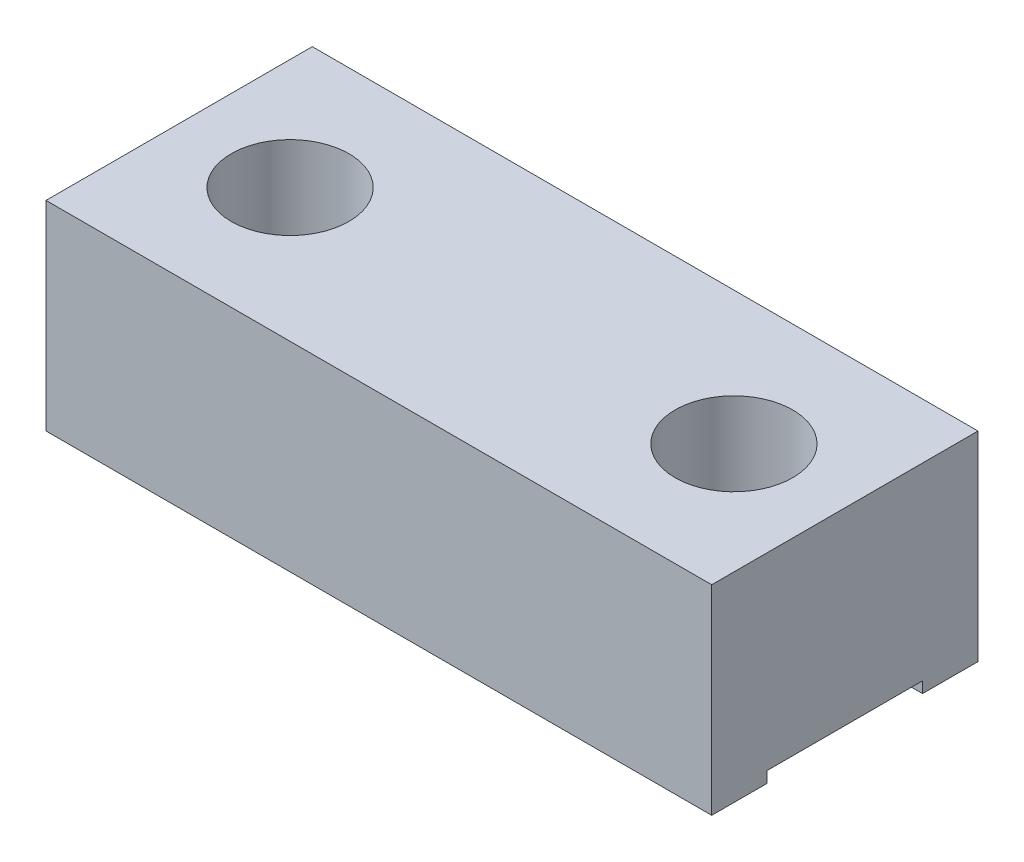
ISO-10303-21;
HEADER;
FILE_DESCRIPTION(('STEP AP214'),'2;1');
FILE_NAME('part.step','',(''),(''),'','','');
FILE_SCHEMA(('AUTOMOTIVE_DESIGN { 1 0 10303 214 1 1 1 1 }'));
ENDSEC;
DATA;
#1=APPLICATION_CONTEXT('core data for automotive mechanical design processes');
#2=APPLICATION_PROTOCOL_DEFINITION('international standard','automotive_design',2000,#1);
#3=PRODUCT_CONTEXT('',#1,'mechanical');
#4=PRODUCT('Part','Part','',(#3));
#5=PRODUCT_RELATED_PRODUCT_CATEGORY('part','',(#4));
#6=PRODUCT_DEFINITION_FORMATION('','',#4);
#7=PRODUCT_DEFINITION_CONTEXT('part definition',#1,'design');
#8=PRODUCT_DEFINITION('design','',#6,#7);
#9=PRODUCT_DEFINITION_SHAPE('','',#8);
#10=(LENGTH_UNIT() NAMED_UNIT(*) SI_UNIT(.MILLI.,.METRE.));
#11=(NAMED_UNIT(*) PLANE_ANGLE_UNIT() SI_UNIT($,.RADIAN.));
#12=(NAMED_UNIT(*) SI_UNIT($,.STERADIAN.) SOLID_ANGLE_UNIT());
#13=UNCERTAINTY_MEASURE_WITH_UNIT(LENGTH_MEASURE(1.E-05),#10,'distance_accuracy_value','');
#14=(GEOMETRIC_REPRESENTATION_CONTEXT(3) GLOBAL_UNCERTAINTY_ASSIGNED_CONTEXT((#13)) GLOBAL_UNIT_ASSIGNED_CONTEXT((#10,
#11,#12)) REPRESENTATION_CONTEXT('',''));
#15=CARTESIAN_POINT('',(0.,0.,0.));
#16=DIRECTION('',(0.,0.,1.));
#17=DIRECTION('',(1.,0.,0.));
#18=AXIS2_PLACEMENT_3D('',#15,#16,#17);
#19=CARTESIAN_POINT('',(-15.,9.5,-2.));
#20=DIRECTION('',(0.,-1.,0.));
#21=DIRECTION('',(0.,0.,-1.));
#22=AXIS2_PLACEMENT_3D('',#19,#20,#21);
#23=PLANE('',#22);
#24=DIRECTION('',(1.,0.,0.));
#25=VECTOR('',#24,1.);
#26=CARTESIAN_POINT('',(-15.,9.5,-14.));
#27=LINE('',#26,#25);
#28=CARTESIAN_POINT('',(-15.,9.5,-14.));
#29=VERTEX_POINT('',#28);
#30=CARTESIAN_POINT('',(15.,9.5,-14.));
#31=VERTEX_POINT('',#30);
#32=EDGE_CURVE('E158',#29,#31,#27,.T.);
#33=ORIENTED_EDGE('',*,*,#32,.F.);
#34=DIRECTION('',(0.,0.,-1.));
#35=VECTOR('',#34,1.);
#36=CARTESIAN_POINT('',(-15.,9.5,-2.));
#37=LINE('',#36,#35);
#38=CARTESIAN_POINT('',(-15.,9.5,-2.));
#39=VERTEX_POINT('',#38);
#40=EDGE_CURVE('E157',#39,#29,#37,.T.);
#41=ORIENTED_EDGE('',*,*,#40,.F.);
#42=DIRECTION('',(1.,0.,0.));
#43=VECTOR('',#42,1.);
#44=CARTESIAN_POINT('',(-15.,9.5,-2.));
#45=LINE('',#44,#43);
#46=CARTESIAN_POINT('',(15.,9.5,-2.));
#47=VERTEX_POINT('',#46);
#48=EDGE_CURVE('E85',#39,#47,#45,.T.);
#49=ORIENTED_EDGE('',*,*,#48,.T.);
#50=DIRECTION('',(0.,0.,-1.));
#51=VECTOR('',#50,1.);
#52=CARTESIAN_POINT('',(15.,9.5,-2.));
#53=LINE('',#52,#51);
#54=EDGE_CURVE('E81',#47,#31,#53,.T.);
#55=ORIENTED_EDGE('',*,*,#54,.T.);
#56=EDGE_LOOP('',(#33,#41,#49,#55));
#57=FACE_BOUND('',#56,.T.);
#58=CARTESIAN_POINT('',(9.99999999999999,9.5,-8.));
#59=DIRECTION('',(0.,1.,0.));
#60=DIRECTION('',(0.,0.,1.));
#61=AXIS2_PLACEMENT_3D('',#58,#59,#60);
#62=CIRCLE('',#61,2.64999999999999);
#63=CARTESIAN_POINT('',(9.99999999999999,9.5,-5.35000000000001));
#64=VERTEX_POINT('',#63);
#65=EDGE_CURVE('E198',#64,#64,#62,.T.);
#66=ORIENTED_EDGE('',*,*,#65,.F.);
#67=EDGE_LOOP('',(#66));
#68=FACE_BOUND('',#67,.T.);
#69=CARTESIAN_POINT('',(-9.99999999999999,9.5,-8.));
#70=DIRECTION('',(0.,1.,0.));
#71=DIRECTION('',(0.,0.,1.));
#72=AXIS2_PLACEMENT_3D('',#69,#70,#71);
#73=CIRCLE('',#72,2.64999999999999);
#74=CARTESIAN_POINT('',(-9.99999999999999,9.5,-5.35000000000001));
#75=VERTEX_POINT('',#74);
#76=EDGE_CURVE('E204',#75,#75,#73,.T.);
#77=ORIENTED_EDGE('',*,*,#76,.F.);
#78=EDGE_LOOP('',(#77));
#79=FACE_BOUND('',#78,.T.);
#80=ADVANCED_FACE('F49',(#57,#68,#79),#23,.F.);
#81=CARTESIAN_POINT('',(-15.,0.5,-11.5));
#82=DIRECTION('',(0.,1.,0.));
#83=DIRECTION('',(0.,0.,1.));
#84=AXIS2_PLACEMENT_3D('',#81,#82,#83);
#85=PLANE('',#84);
#86=DIRECTION('',(1.,0.,0.));
#87=VECTOR('',#86,1.);
#88=CARTESIAN_POINT('',(-15.,0.5,-11.5));
#89=LINE('',#88,#87);
#90=CARTESIAN_POINT('',(-15.,0.5,-11.5));
#91=VERTEX_POINT('',#90);
#92=CARTESIAN_POINT('',(15.,0.5,-11.5));
#93=VERTEX_POINT('',#92);
#94=EDGE_CURVE('E153',#91,#93,#89,.T.);
#95=ORIENTED_EDGE('',*,*,#94,.F.);
#96=DIRECTION('',(0.,0.,1.));
#97=VECTOR('',#96,1.);
#98=CARTESIAN_POINT('',(-15.,0.5,-11.5));
#99=LINE('',#98,#97);
#100=CARTESIAN_POINT('',(-15.,0.5,-14.));
#101=VERTEX_POINT('',#100);
#102=EDGE_CURVE('E145',#101,#91,#99,.T.);
#103=ORIENTED_EDGE('',*,*,#102,.F.);
#104=DIRECTION('',(1.,0.,0.));
#105=VECTOR('',#104,1.);
#106=CARTESIAN_POINT('',(-15.,0.5,-14.));
#107=LINE('',#106,#105);
#108=CARTESIAN_POINT('',(15.,0.5,-14.));
#109=VERTEX_POINT('',#108);
#110=EDGE_CURVE('E93',#101,#109,#107,.T.);
#111=ORIENTED_EDGE('',*,*,#110,.T.);
#112=DIRECTION('',(0.,0.,1.));
#113=VECTOR('',#112,1.);
#114=CARTESIAN_POINT('',(15.,0.5,-11.5));
#115=LINE('',#114,#113);
#116=EDGE_CURVE('E164',#109,#93,#115,.T.);
#117=ORIENTED_EDGE('',*,*,#116,.T.);
#118=EDGE_LOOP('',(#95,#103,#111,#117));
#119=FACE_BOUND('',#118,.T.);
#120=ADVANCED_FACE('F189',(#119),#85,.F.);
#121=CARTESIAN_POINT('',(-15.,0.5,-11.5));
#122=DIRECTION('',(0.,0.,-1.));
#123=DIRECTION('',(-1.,0.,0.));
#124=AXIS2_PLACEMENT_3D('',#121,#122,#123);
#125=PLANE('',#124);
#126=DIRECTION('',(1.,0.,0.));
#127=VECTOR('',#126,1.);
#128=CARTESIAN_POINT('',(-15.,1.,-11.5));
#129=LINE('',#128,#127);
#130=CARTESIAN_POINT('',(-15.,1.,-11.5));
#131=VERTEX_POINT('',#130);
#132=CARTESIAN_POINT('',(15.,1.,-11.5));
#133=VERTEX_POINT('',#132);
#134=EDGE_CURVE('E132',#131,#133,#129,.T.);
#135=ORIENTED_EDGE('',*,*,#134,.F.);
#136=DIRECTION('',(0.,1.,0.));
#137=VECTOR('',#136,1.);
#138=CARTESIAN_POINT('',(-15.,0.5,-11.5));
#139=LINE('',#138,#137);
#140=EDGE_CURVE('E143',#91,#131,#139,.T.);
#141=ORIENTED_EDGE('',*,*,#140,.F.);
#142=ORIENTED_EDGE('',*,*,#94,.T.);
#143=DIRECTION('',(0.,1.,0.));
#144=VECTOR('',#143,1.);
#145=CARTESIAN_POINT('',(15.,0.5,-11.5));
#146=LINE('',#145,#144);
#147=EDGE_CURVE('E186',#93,#133,#146,.T.);
#148=ORIENTED_EDGE('',*,*,#147,.T.);
#149=EDGE_LOOP('',(#135,#141,#142,#148));
#150=FACE_BOUND('',#149,.T.);
#151=ADVANCED_FACE('F217',(#150),#125,.F.);
#152=CARTESIAN_POINT('',(-15.,1.,-4.5));
#153=DIRECTION('',(0.,1.,0.));
#154=DIRECTION('',(0.,0.,1.));
#155=AXIS2_PLACEMENT_3D('',#152,#153,#154);
#156=PLANE('',#155);
#157=CARTESIAN_POINT('',(-9.99999999999999,0.999999999999999,-8.));
#158=DIRECTION('',(0.,1.,0.));
#159=DIRECTION('',(0.,0.,1.));
#160=AXIS2_PLACEMENT_3D('',#157,#158,#159);
#161=CIRCLE('',#160,2.64999999999999);
#162=CARTESIAN_POINT('',(-9.99999999999999,0.999999999999999,-5.35000000000001));
#163=VERTEX_POINT('',#162);
#164=EDGE_CURVE('E201',#163,#163,#161,.T.);
#165=ORIENTED_EDGE('',*,*,#164,.T.);
#166=EDGE_LOOP('',(#165));
#167=FACE_BOUND('',#166,.T.);
#168=CARTESIAN_POINT('',(9.99999999999999,0.999999999999999,-8.));
#169=DIRECTION('',(0.,1.,0.));
#170=DIRECTION('',(0.,0.,1.));
#171=AXIS2_PLACEMENT_3D('',#168,#169,#170);
#172=CIRCLE('',#171,2.64999999999999);
#173=CARTESIAN_POINT('',(9.99999999999999,0.999999999999999,-5.35000000000001));
#174=VERTEX_POINT('',#173);
#175=EDGE_CURVE('E160',#174,#174,#172,.T.);
#176=ORIENTED_EDGE('',*,*,#175,.T.);
#177=EDGE_LOOP('',(#176));
#178=FACE_BOUND('',#177,.T.);
#179=DIRECTION('',(1.,0.,0.));
#180=VECTOR('',#179,1.);
#181=CARTESIAN_POINT('',(-15.,1.,-4.5));
#182=LINE('',#181,#180);
#183=CARTESIAN_POINT('',(-15.,1.,-4.5));
#184=VERTEX_POINT('',#183);
#185=CARTESIAN_POINT('',(15.,1.,-4.5));
#186=VERTEX_POINT('',#185);
#187=EDGE_CURVE('E120',#184,#186,#182,.T.);
#188=ORIENTED_EDGE('',*,*,#187,.F.);
#189=DIRECTION('',(0.,0.,1.));
#190=VECTOR('',#189,1.);
#191=CARTESIAN_POINT('',(-15.,1.,-4.5));
#192=LINE('',#191,#190);
#193=EDGE_CURVE('E124',#131,#184,#192,.T.);
#194=ORIENTED_EDGE('',*,*,#193,.F.);
#195=ORIENTED_EDGE('',*,*,#134,.T.);
#196=DIRECTION('',(0.,0.,1.));
#197=VECTOR('',#196,1.);
#198=CARTESIAN_POINT('',(15.,1.,-4.5));
#199=LINE('',#198,#197);
#200=EDGE_CURVE('E127',#133,#186,#199,.T.);
#201=ORIENTED_EDGE('',*,*,#200,.T.);
#202=EDGE_LOOP('',(#188,#194,#195,#201));
#203=FACE_BOUND('',#202,.T.);
#204=ADVANCED_FACE('F122',(#167,#178,#203),#156,.F.);
#205=CARTESIAN_POINT('',(15.,58.9187454245971,-2.));
#206=DIRECTION('',(-1.,0.,0.));
#207=DIRECTION('',(0.,0.,1.));
#208=AXIS2_PLACEMENT_3D('',#205,#206,#207);
#209=PLANE('',#208);
#210=DIRECTION('',(0.,-1.,0.));
#211=VECTOR('',#210,1.);
#212=CARTESIAN_POINT('',(15.,58.9187454245971,-2.));
#213=LINE('',#212,#211);
#214=CARTESIAN_POINT('',(15.,0.5,-2.));
#215=VERTEX_POINT('',#214);
#216=EDGE_CURVE('E58',#47,#215,#213,.T.);
#217=ORIENTED_EDGE('',*,*,#216,.T.);
#218=DIRECTION('',(0.,0.,1.));
#219=VECTOR('',#218,1.);
#220=CARTESIAN_POINT('',(15.,0.5,-2.));
#221=LINE('',#220,#219);
#222=CARTESIAN_POINT('',(15.,0.5,-4.5));
#223=VERTEX_POINT('',#222);
#224=EDGE_CURVE('E177',#223,#215,#221,.T.);
#225=ORIENTED_EDGE('',*,*,#224,.F.);
#226=DIRECTION('',(0.,-1.,0.));
#227=VECTOR('',#226,1.);
#228=CARTESIAN_POINT('',(15.,0.5,-4.5));
#229=LINE('',#228,#227);
#230=EDGE_CURVE('E183',#186,#223,#229,.T.);
#231=ORIENTED_EDGE('',*,*,#230,.F.);
#232=ORIENTED_EDGE('',*,*,#200,.F.);
#233=ORIENTED_EDGE('',*,*,#147,.F.);
#234=ORIENTED_EDGE('',*,*,#116,.F.);
#235=DIRECTION('',(0.,-1.,0.));
#236=VECTOR('',#235,1.);
#237=CARTESIAN_POINT('',(15.,58.9187454245971,-14.));
#238=LINE('',#237,#236);
#239=EDGE_CURVE('E170',#31,#109,#238,.T.);
#240=ORIENTED_EDGE('',*,*,#239,.F.);
#241=ORIENTED_EDGE('',*,*,#54,.F.);
#242=EDGE_LOOP('',(#217,#225,#231,#232,#233,#234,#240,#241));
#243=FACE_BOUND('',#242,.T.);
#244=ADVANCED_FACE('F176',(#243),#209,.F.);
#245=CARTESIAN_POINT('',(-15.,0.5,-4.5));
#246=DIRECTION('',(0.,0.,1.));
#247=DIRECTION('',(1.,0.,0.));
#248=AXIS2_PLACEMENT_3D('',#245,#246,#247);
#249=PLANE('',#248);
#250=DIRECTION('',(1.,0.,0.));
#251=VECTOR('',#250,1.);
#252=CARTESIAN_POINT('',(-15.,0.5,-4.5));
#253=LINE('',#252,#251);
#254=CARTESIAN_POINT('',(-15.,0.5,-4.5));
#255=VERTEX_POINT('',#254);
#256=EDGE_CURVE('E131',#255,#223,#253,.T.);
#257=ORIENTED_EDGE('',*,*,#256,.F.);
#258=DIRECTION('',(0.,-1.,0.));
#259=VECTOR('',#258,1.);
#260=CARTESIAN_POINT('',(-15.,0.5,-4.5));
#261=LINE('',#260,#259);
#262=EDGE_CURVE('E135',#184,#255,#261,.T.);
#263=ORIENTED_EDGE('',*,*,#262,.F.);
#264=ORIENTED_EDGE('',*,*,#187,.T.);
#265=ORIENTED_EDGE('',*,*,#230,.T.);
#266=EDGE_LOOP('',(#257,#263,#264,#265));
#267=FACE_BOUND('',#266,.T.);
#268=ADVANCED_FACE('F136',(#267),#249,.F.);
#269=CARTESIAN_POINT('',(-15.,58.9187454245971,-14.));
#270=DIRECTION('',(1.,0.,0.));
#271=DIRECTION('',(0.,0.,-1.));
#272=AXIS2_PLACEMENT_3D('',#269,#270,#271);
#273=PLANE('',#272);
#274=ORIENTED_EDGE('',*,*,#262,.T.);
#275=DIRECTION('',(0.,0.,1.));
#276=VECTOR('',#275,1.);
#277=CARTESIAN_POINT('',(-15.,0.5,-2.));
#278=LINE('',#277,#276);
#279=CARTESIAN_POINT('',(-15.,0.5,-2.));
#280=VERTEX_POINT('',#279);
#281=EDGE_CURVE('E138',#255,#280,#278,.T.);
#282=ORIENTED_EDGE('',*,*,#281,.T.);
#283=DIRECTION('',(0.,-1.,0.));
#284=VECTOR('',#283,1.);
#285=CARTESIAN_POINT('',(-15.,58.9187454245971,-2.));
#286=LINE('',#285,#284);
#287=EDGE_CURVE('E150',#39,#280,#286,.T.);
#288=ORIENTED_EDGE('',*,*,#287,.F.);
#289=ORIENTED_EDGE('',*,*,#40,.T.);
#290=DIRECTION('',(0.,-1.,0.));
#291=VECTOR('',#290,1.);
#292=CARTESIAN_POINT('',(-15.,58.9187454245971,-14.));
#293=LINE('',#292,#291);
#294=EDGE_CURVE('E167',#29,#101,#293,.T.);
#295=ORIENTED_EDGE('',*,*,#294,.T.);
#296=ORIENTED_EDGE('',*,*,#102,.T.);
#297=ORIENTED_EDGE('',*,*,#140,.T.);
#298=ORIENTED_EDGE('',*,*,#193,.T.);
#299=EDGE_LOOP('',(#274,#282,#288,#289,#295,#296,#297,#298));
#300=FACE_BOUND('',#299,.T.);
#301=ADVANCED_FACE('F140',(#300),#273,.F.);
#302=CARTESIAN_POINT('',(-15.,0.5,-2.));
#303=DIRECTION('',(0.,1.,0.));
#304=DIRECTION('',(0.,0.,1.));
#305=AXIS2_PLACEMENT_3D('',#302,#303,#304);
#306=PLANE('',#305);
#307=DIRECTION('',(1.,0.,0.));
#308=VECTOR('',#307,1.);
#309=CARTESIAN_POINT('',(12.5,0.5,-2.00000000000001));
#310=LINE('',#309,#308);
#311=EDGE_CURVE('E11',#280,#215,#310,.T.);
#312=ORIENTED_EDGE('',*,*,#311,.F.);
#313=ORIENTED_EDGE('',*,*,#281,.F.);
#314=ORIENTED_EDGE('',*,*,#256,.T.);
#315=ORIENTED_EDGE('',*,*,#224,.T.);
#316=EDGE_LOOP('',(#312,#313,#314,#315));
#317=FACE_BOUND('',#316,.T.);
#318=ADVANCED_FACE('F182',(#317),#306,.F.);
#319=CARTESIAN_POINT('',(15.,58.9187454245971,-14.));
#320=DIRECTION('',(0.,0.,1.));
#321=DIRECTION('',(1.,0.,0.));
#322=AXIS2_PLACEMENT_3D('',#319,#320,#321);
#323=PLANE('',#322);
#324=ORIENTED_EDGE('',*,*,#239,.T.);
#325=ORIENTED_EDGE('',*,*,#110,.F.);
#326=ORIENTED_EDGE('',*,*,#294,.F.);
#327=ORIENTED_EDGE('',*,*,#32,.T.);
#328=EDGE_LOOP('',(#324,#325,#326,#327));
#329=FACE_BOUND('',#328,.T.);
#330=ADVANCED_FACE('F191',(#329),#323,.F.);
#331=CARTESIAN_POINT('',(12.5,58.9187454245971,-2.00000000000001));
#332=DIRECTION('',(0.,0.,-1.));
#333=DIRECTION('',(-1.,0.,0.));
#334=AXIS2_PLACEMENT_3D('',#331,#332,#333);
#335=PLANE('',#334);
#336=ORIENTED_EDGE('',*,*,#216,.F.);
#337=ORIENTED_EDGE('',*,*,#48,.F.);
#338=ORIENTED_EDGE('',*,*,#287,.T.);
#339=ORIENTED_EDGE('',*,*,#311,.T.);
#340=EDGE_LOOP('',(#336,#337,#338,#339));
#341=FACE_BOUND('',#340,.T.);
#342=ADVANCED_FACE('F51',(#341),#335,.F.);
#343=CARTESIAN_POINT('',(9.99999999999999,9.5,-8.));
#344=DIRECTION('',(0.,1.,0.));
#345=DIRECTION('',(0.,0.,1.));
#346=AXIS2_PLACEMENT_3D('',#343,#344,#345);
#347=CYLINDRICAL_SURFACE('',#346,2.64999999999999);
#348=ORIENTED_EDGE('',*,*,#175,.F.);
#349=EDGE_LOOP('',(#348));
#350=FACE_BOUND('',#349,.T.);
#351=ORIENTED_EDGE('',*,*,#65,.T.);
#352=EDGE_LOOP('',(#351));
#353=FACE_BOUND('',#352,.T.);
#354=ADVANCED_FACE('F219',(#350,#353),#347,.F.);
#355=CARTESIAN_POINT('',(-9.99999999999999,9.5,-8.));
#356=DIRECTION('',(0.,1.,0.));
#357=DIRECTION('',(0.,0.,1.));
#358=AXIS2_PLACEMENT_3D('',#355,#356,#357);
#359=CYLINDRICAL_SURFACE('',#358,2.64999999999999);
#360=ORIENTED_EDGE('',*,*,#164,.F.);
#361=EDGE_LOOP('',(#360));
#362=FACE_BOUND('',#361,.T.);
#363=ORIENTED_EDGE('',*,*,#76,.T.);
#364=EDGE_LOOP('',(#363));
#365=FACE_BOUND('',#364,.T.);
#366=ADVANCED_FACE('F208',(#362,#365),#359,.F.);
#367=CLOSED_SHELL('',(#80,#120,#151,#204,#244,#268,#301,#318,#330,#342,#354,#366));
#368=MANIFOLD_SOLID_BREP('B2',#367);
#369=ADVANCED_BREP_SHAPE_REPRESENTATION('',(#18,#368),#14);
#370=SHAPE_DEFINITION_REPRESENTATION(#9,#369);
ENDSEC;
END-ISO-10303-21;
